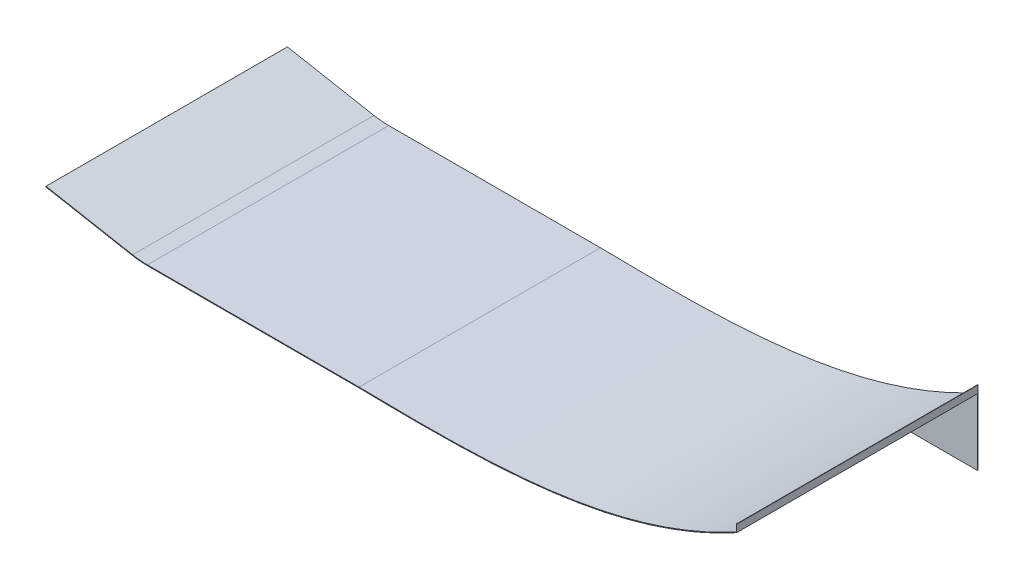
ISO-10303-21;
HEADER;
FILE_DESCRIPTION(('STEP AP214'),'2;1');
FILE_NAME('part.step','',(''),(''),'','','');
FILE_SCHEMA(('AUTOMOTIVE_DESIGN { 1 0 10303 214 1 1 1 1 }'));
ENDSEC;
DATA;
#1=APPLICATION_CONTEXT('core data for automotive mechanical design processes');
#2=APPLICATION_PROTOCOL_DEFINITION('international standard','automotive_design',2000,#1);
#3=PRODUCT_CONTEXT('',#1,'mechanical');
#4=PRODUCT('Part','Part','',(#3));
#5=PRODUCT_RELATED_PRODUCT_CATEGORY('part','',(#4));
#6=PRODUCT_DEFINITION_FORMATION('','',#4);
#7=PRODUCT_DEFINITION_CONTEXT('part definition',#1,'design');
#8=PRODUCT_DEFINITION('design','',#6,#7);
#9=PRODUCT_DEFINITION_SHAPE('','',#8);
#10=(LENGTH_UNIT() NAMED_UNIT(*) SI_UNIT(.MILLI.,.METRE.));
#11=(NAMED_UNIT(*) PLANE_ANGLE_UNIT() SI_UNIT($,.RADIAN.));
#12=(NAMED_UNIT(*) SI_UNIT($,.STERADIAN.) SOLID_ANGLE_UNIT());
#13=UNCERTAINTY_MEASURE_WITH_UNIT(LENGTH_MEASURE(1.E-05),#10,'distance_accuracy_value','');
#14=(GEOMETRIC_REPRESENTATION_CONTEXT(3) GLOBAL_UNCERTAINTY_ASSIGNED_CONTEXT((#13)) GLOBAL_UNIT_ASSIGNED_CONTEXT((#10,
#11,#12)) REPRESENTATION_CONTEXT('',''));
#15=CARTESIAN_POINT('',(0.,0.,0.));
#16=DIRECTION('',(0.,0.,1.));
#17=DIRECTION('',(1.,0.,0.));
#18=AXIS2_PLACEMENT_3D('',#15,#16,#17);
#19=CARTESIAN_POINT('',(-20.0604296246688,1.68392033592968,656.));
#20=DIRECTION('',(-0.182235525492141,-0.983254907563956,0.));
#21=DIRECTION('',(0.983254907563956,-0.182235525492141,0.));
#22=AXIS2_PLACEMENT_3D('',#19,#20,#21);
#23=PLANE('',#22);
#24=DIRECTION('',(0.,0.,-1.));
#25=VECTOR('',#24,1.);
#26=CARTESIAN_POINT('',(-20.0604296246687,1.68392033592971,656.));
#27=LINE('',#26,#25);
#28=CARTESIAN_POINT('',(-20.0604296246687,1.68392033592971,524.8));
#29=VERTEX_POINT('',#28);
#30=CARTESIAN_POINT('',(-20.0604296246687,1.68392033592971,395.6));
#31=VERTEX_POINT('',#30);
#32=EDGE_CURVE('E465',#29,#31,#27,.T.);
#33=ORIENTED_EDGE('',*,*,#32,.F.);
#34=DIRECTION('',(-0.983254907563956,0.182235525492141,0.));
#35=VECTOR('',#34,1.);
#36=CARTESIAN_POINT('',(-20.0604296246688,1.68392033592968,524.8));
#37=LINE('',#36,#35);
#38=CARTESIAN_POINT('',(-255.328384959634,45.2882584807055,524.8));
#39=VERTEX_POINT('',#38);
#40=EDGE_CURVE('E52',#29,#39,#37,.T.);
#41=ORIENTED_EDGE('',*,*,#40,.T.);
#42=DIRECTION('',(0.,0.,-1.));
#43=VECTOR('',#42,1.);
#44=CARTESIAN_POINT('',(-255.328384959634,45.2882584807055,656.));
#45=LINE('',#44,#43);
#46=CARTESIAN_POINT('',(-255.328384959634,45.2882584807055,395.6));
#47=VERTEX_POINT('',#46);
#48=EDGE_CURVE('E485',#39,#47,#45,.T.);
#49=ORIENTED_EDGE('',*,*,#48,.T.);
#50=DIRECTION('',(-0.983254907563956,0.182235525492141,0.));
#51=VECTOR('',#50,1.);
#52=CARTESIAN_POINT('',(-20.0604296246688,1.68392033592968,395.6));
#53=LINE('',#52,#51);
#54=EDGE_CURVE('E276',#31,#47,#53,.T.);
#55=ORIENTED_EDGE('',*,*,#54,.F.);
#56=EDGE_LOOP('',(#33,#41,#49,#55));
#57=FACE_BOUND('',#56,.T.);
#58=ADVANCED_FACE('F37',(#57),#23,.T.);
#59=CARTESIAN_POINT('',(-20.0604296246687,1.68392033592971,393.6));
#60=VERTEX_POINT('',#59);
#61=CARTESIAN_POINT('',(-20.0604296246687,1.68392033592971,264.4));
#62=VERTEX_POINT('',#61);
#63=EDGE_CURVE('E458',#60,#62,#27,.T.);
#64=ORIENTED_EDGE('',*,*,#63,.F.);
#65=DIRECTION('',(-0.983254907563956,0.182235525492141,0.));
#66=VECTOR('',#65,1.);
#67=CARTESIAN_POINT('',(-20.0604296246688,1.68392033592968,393.6));
#68=LINE('',#67,#66);
#69=CARTESIAN_POINT('',(-255.328384959634,45.2882584807055,393.6));
#70=VERTEX_POINT('',#69);
#71=EDGE_CURVE('E60',#60,#70,#68,.T.);
#72=ORIENTED_EDGE('',*,*,#71,.T.);
#73=CARTESIAN_POINT('',(-255.328384959634,45.2882584807055,264.4));
#74=VERTEX_POINT('',#73);
#75=EDGE_CURVE('E484',#70,#74,#45,.T.);
#76=ORIENTED_EDGE('',*,*,#75,.T.);
#77=DIRECTION('',(-0.983254907563956,0.182235525492141,0.));
#78=VECTOR('',#77,1.);
#79=CARTESIAN_POINT('',(-20.0604296246688,1.68392033592968,264.4));
#80=LINE('',#79,#78);
#81=EDGE_CURVE('E295',#62,#74,#80,.T.);
#82=ORIENTED_EDGE('',*,*,#81,.F.);
#83=EDGE_LOOP('',(#64,#72,#76,#82));
#84=FACE_BOUND('',#83,.T.);
#85=ADVANCED_FACE('F417',(#84),#23,.T.);
#86=CARTESIAN_POINT('',(-20.0604296246687,1.68392033592971,262.4));
#87=VERTEX_POINT('',#86);
#88=CARTESIAN_POINT('',(-20.0604296246687,1.68392033592971,133.2));
#89=VERTEX_POINT('',#88);
#90=EDGE_CURVE('E454',#87,#89,#27,.T.);
#91=ORIENTED_EDGE('',*,*,#90,.F.);
#92=DIRECTION('',(-0.983254907563956,0.182235525492141,0.));
#93=VECTOR('',#92,1.);
#94=CARTESIAN_POINT('',(-20.0604296246688,1.68392033592968,262.4));
#95=LINE('',#94,#93);
#96=CARTESIAN_POINT('',(-255.328384959634,45.2882584807055,262.4));
#97=VERTEX_POINT('',#96);
#98=EDGE_CURVE('E292',#87,#97,#95,.T.);
#99=ORIENTED_EDGE('',*,*,#98,.T.);
#100=CARTESIAN_POINT('',(-255.328384959634,45.2882584807055,133.2));
#101=VERTEX_POINT('',#100);
#102=EDGE_CURVE('E467',#97,#101,#45,.T.);
#103=ORIENTED_EDGE('',*,*,#102,.T.);
#104=DIRECTION('',(-0.983254907563956,0.182235525492141,0.));
#105=VECTOR('',#104,1.);
#106=CARTESIAN_POINT('',(-20.0604296246688,1.68392033592968,133.2));
#107=LINE('',#106,#105);
#108=EDGE_CURVE('E314',#89,#101,#107,.T.);
#109=ORIENTED_EDGE('',*,*,#108,.F.);
#110=EDGE_LOOP('',(#91,#99,#103,#109));
#111=FACE_BOUND('',#110,.T.);
#112=ADVANCED_FACE('F424',(#111),#23,.T.);
#113=CARTESIAN_POINT('',(-20.0604296246687,1.68392033592971,131.2));
#114=VERTEX_POINT('',#113);
#115=CARTESIAN_POINT('',(-20.0604296246687,1.68392033592971,2.));
#116=VERTEX_POINT('',#115);
#117=EDGE_CURVE('E451',#114,#116,#27,.T.);
#118=ORIENTED_EDGE('',*,*,#117,.F.);
#119=DIRECTION('',(-0.983254907563956,0.182235525492141,0.));
#120=VECTOR('',#119,1.);
#121=CARTESIAN_POINT('',(-20.0604296246688,1.68392033592968,131.2));
#122=LINE('',#121,#120);
#123=CARTESIAN_POINT('',(-255.328384959634,45.2882584807055,131.2));
#124=VERTEX_POINT('',#123);
#125=EDGE_CURVE('E311',#114,#124,#122,.T.);
#126=ORIENTED_EDGE('',*,*,#125,.T.);
#127=CARTESIAN_POINT('',(-255.328384959634,45.2882584807055,2.));
#128=VERTEX_POINT('',#127);
#129=EDGE_CURVE('E464',#124,#128,#45,.T.);
#130=ORIENTED_EDGE('',*,*,#129,.T.);
#131=DIRECTION('',(-0.983254907563956,0.182235525492141,0.));
#132=VECTOR('',#131,1.);
#133=CARTESIAN_POINT('',(-255.328384959634,45.2882584807055,2.));
#134=LINE('',#133,#132);
#135=EDGE_CURVE('E321',#116,#128,#134,.T.);
#136=ORIENTED_EDGE('',*,*,#135,.F.);
#137=EDGE_LOOP('',(#118,#126,#130,#136));
#138=FACE_BOUND('',#137,.T.);
#139=ADVANCED_FACE('F432',(#138),#23,.T.);
#140=CARTESIAN_POINT('',(20.2151601669387,0.,656.));
#141=DIRECTION('',(0.,1.,0.));
#142=DIRECTION('',(0.,0.,1.));
#143=AXIS2_PLACEMENT_3D('',#140,#141,#142);
#144=PLANE('',#143);
#145=DIRECTION('',(1.,0.,0.));
#146=VECTOR('',#145,1.);
#147=CARTESIAN_POINT('',(20.2151601669387,0.,0.));
#148=LINE('',#147,#146);
#149=CARTESIAN_POINT('',(20.2151601669387,0.,0.));
#150=VERTEX_POINT('',#149);
#151=CARTESIAN_POINT('',(595.62,0.,0.));
#152=VERTEX_POINT('',#151);
#153=EDGE_CURVE('E341',#150,#152,#148,.T.);
#154=ORIENTED_EDGE('',*,*,#153,.F.);
#155=DIRECTION('',(0.,0.,-1.));
#156=VECTOR('',#155,1.);
#157=CARTESIAN_POINT('',(20.2151601669387,0.,656.));
#158=LINE('',#157,#156);
#159=CARTESIAN_POINT('',(20.2151601669387,0.,656.));
#160=VERTEX_POINT('',#159);
#161=EDGE_CURVE('E491',#160,#150,#158,.T.);
#162=ORIENTED_EDGE('',*,*,#161,.F.);
#163=DIRECTION('',(1.,0.,0.));
#164=VECTOR('',#163,1.);
#165=CARTESIAN_POINT('',(20.2151601669387,0.,656.));
#166=LINE('',#165,#164);
#167=CARTESIAN_POINT('',(595.62,0.,656.));
#168=VERTEX_POINT('',#167);
#169=EDGE_CURVE('E346',#160,#168,#166,.T.);
#170=ORIENTED_EDGE('',*,*,#169,.T.);
#171=DIRECTION('',(0.,0.,-1.));
#172=VECTOR('',#171,1.);
#173=CARTESIAN_POINT('',(595.62,0.,656.));
#174=LINE('',#173,#172);
#175=EDGE_CURVE('E523',#168,#152,#174,.T.);
#176=ORIENTED_EDGE('',*,*,#175,.T.);
#177=EDGE_LOOP('',(#154,#162,#170,#176));
#178=FACE_BOUND('',#177,.T.);
#179=ADVANCED_FACE('F39',(#178),#144,.T.);
#180=CARTESIAN_POINT('',(20.2151601669379,220.,656.));
#181=DIRECTION('',(0.,0.,-1.));
#182=DIRECTION('',(-1.,0.,0.));
#183=AXIS2_PLACEMENT_3D('',#180,#181,#182);
#184=CYLINDRICAL_SURFACE('',#183,220.);
#185=ORIENTED_EDGE('',*,*,#161,.T.);
#186=CARTESIAN_POINT('',(20.2151601669379,220.,0.));
#187=DIRECTION('',(0.,0.,-1.));
#188=DIRECTION('',(-1.,0.,0.));
#189=AXIS2_PLACEMENT_3D('',#186,#187,#188);
#190=CIRCLE('',#189,220.);
#191=CARTESIAN_POINT('',(-19.8766554413338,3.68392033592986,0.));
#192=VERTEX_POINT('',#191);
#193=EDGE_CURVE('E494',#150,#192,#190,.T.);
#194=ORIENTED_EDGE('',*,*,#193,.T.);
#195=DIRECTION('',(0.,0.,-1.));
#196=VECTOR('',#195,1.);
#197=CARTESIAN_POINT('',(-19.8766554413338,3.68392033592986,656.));
#198=LINE('',#197,#196);
#199=CARTESIAN_POINT('',(-19.8766554413338,3.68392033592986,656.));
#200=VERTEX_POINT('',#199);
#201=EDGE_CURVE('E489',#200,#192,#198,.T.);
#202=ORIENTED_EDGE('',*,*,#201,.F.);
#203=CARTESIAN_POINT('',(20.2151601669379,220.,656.));
#204=DIRECTION('',(0.,0.,-1.));
#205=DIRECTION('',(-1.,0.,0.));
#206=AXIS2_PLACEMENT_3D('',#203,#204,#205);
#207=CIRCLE('',#206,220.);
#208=EDGE_CURVE('E521',#160,#200,#207,.T.);
#209=ORIENTED_EDGE('',*,*,#208,.F.);
#210=EDGE_LOOP('',(#185,#194,#202,#209));
#211=FACE_BOUND('',#210,.T.);
#212=ADVANCED_FACE('F446',(#211),#184,.F.);
#213=CARTESIAN_POINT('',(-19.8766554413338,3.68392033592986,656.));
#214=DIRECTION('',(-0.182235525492141,-0.983254907563956,0.));
#215=DIRECTION('',(0.983254907563956,-0.182235525492141,0.));
#216=AXIS2_PLACEMENT_3D('',#213,#214,#215);
#217=PLANE('',#216);
#218=ORIENTED_EDGE('',*,*,#201,.T.);
#219=DIRECTION('',(-0.983254907563956,0.182235525492141,0.));
#220=VECTOR('',#219,1.);
#221=CARTESIAN_POINT('',(-19.8766554413338,3.68392033592986,0.));
#222=LINE('',#221,#220);
#223=CARTESIAN_POINT('',(-255.328384959634,47.322319012328,0.));
#224=VERTEX_POINT('',#223);
#225=EDGE_CURVE('E497',#192,#224,#222,.T.);
#226=ORIENTED_EDGE('',*,*,#225,.T.);
#227=DIRECTION('',(0.,0.,-1.));
#228=VECTOR('',#227,1.);
#229=CARTESIAN_POINT('',(-255.328384959634,47.322319012328,656.));
#230=LINE('',#229,#228);
#231=CARTESIAN_POINT('',(-255.328384959634,47.322319012328,656.));
#232=VERTEX_POINT('',#231);
#233=EDGE_CURVE('E487',#232,#224,#230,.T.);
#234=ORIENTED_EDGE('',*,*,#233,.F.);
#235=DIRECTION('',(-0.983254907563956,0.182235525492141,0.));
#236=VECTOR('',#235,1.);
#237=CARTESIAN_POINT('',(-19.8766554413338,3.68392033592986,656.));
#238=LINE('',#237,#236);
#239=EDGE_CURVE('E524',#200,#232,#238,.T.);
#240=ORIENTED_EDGE('',*,*,#239,.F.);
#241=EDGE_LOOP('',(#218,#226,#234,#240));
#242=FACE_BOUND('',#241,.T.);
#243=ADVANCED_FACE('F439',(#242),#217,.F.);
#244=CARTESIAN_POINT('',(-255.328384959634,45.2882584807055,656.));
#245=DIRECTION('',(-1.,0.,0.));
#246=DIRECTION('',(0.,0.,1.));
#247=AXIS2_PLACEMENT_3D('',#244,#245,#246);
#248=PLANE('',#247);
#249=ORIENTED_EDGE('',*,*,#233,.T.);
#250=DIRECTION('',(0.,1.,0.));
#251=VECTOR('',#250,1.);
#252=CARTESIAN_POINT('',(-255.328384959634,45.2882584807055,0.));
#253=LINE('',#252,#251);
#254=CARTESIAN_POINT('',(-255.328384959634,-10.,0.));
#255=VERTEX_POINT('',#254);
#256=EDGE_CURVE('E500',#255,#224,#253,.T.);
#257=ORIENTED_EDGE('',*,*,#256,.F.);
#258=DIRECTION('',(0.,0.,-1.));
#259=VECTOR('',#258,1.);
#260=CARTESIAN_POINT('',(-255.328384959634,-10.,2.));
#261=LINE('',#260,#259);
#262=CARTESIAN_POINT('',(-255.328384959634,-10.,2.));
#263=VERTEX_POINT('',#262);
#264=EDGE_CURVE('E338',#263,#255,#261,.T.);
#265=ORIENTED_EDGE('',*,*,#264,.F.);
#266=DIRECTION('',(0.,-1.,0.));
#267=VECTOR('',#266,1.);
#268=CARTESIAN_POINT('',(-255.328384959634,-10.,2.));
#269=LINE('',#268,#267);
#270=EDGE_CURVE('E324',#128,#263,#269,.T.);
#271=ORIENTED_EDGE('',*,*,#270,.F.);
#272=ORIENTED_EDGE('',*,*,#129,.F.);
#273=DIRECTION('',(0.,-1.,0.));
#274=VECTOR('',#273,1.);
#275=CARTESIAN_POINT('',(-255.328384959634,47.322319012328,131.2));
#276=LINE('',#275,#274);
#277=CARTESIAN_POINT('',(-255.328384959634,0.,131.2));
#278=VERTEX_POINT('',#277);
#279=EDGE_CURVE('E298',#124,#278,#276,.T.);
#280=ORIENTED_EDGE('',*,*,#279,.T.);
#281=DIRECTION('',(0.,0.,-1.));
#282=VECTOR('',#281,1.);
#283=CARTESIAN_POINT('',(-255.328384959634,0.,133.2));
#284=LINE('',#283,#282);
#285=CARTESIAN_POINT('',(-255.328384959634,0.,133.2));
#286=VERTEX_POINT('',#285);
#287=EDGE_CURVE('E305',#286,#278,#284,.T.);
#288=ORIENTED_EDGE('',*,*,#287,.F.);
#289=DIRECTION('',(0.,-1.,0.));
#290=VECTOR('',#289,1.);
#291=CARTESIAN_POINT('',(-255.328384959634,47.322319012328,133.2));
#292=LINE('',#291,#290);
#293=EDGE_CURVE('E299',#101,#286,#292,.T.);
#294=ORIENTED_EDGE('',*,*,#293,.F.);
#295=ORIENTED_EDGE('',*,*,#102,.F.);
#296=DIRECTION('',(0.,-1.,0.));
#297=VECTOR('',#296,1.);
#298=CARTESIAN_POINT('',(-255.328384959634,47.322319012328,262.4));
#299=LINE('',#298,#297);
#300=CARTESIAN_POINT('',(-255.328384959634,0.,262.4));
#301=VERTEX_POINT('',#300);
#302=EDGE_CURVE('E279',#97,#301,#299,.T.);
#303=ORIENTED_EDGE('',*,*,#302,.T.);
#304=DIRECTION('',(0.,0.,-1.));
#305=VECTOR('',#304,1.);
#306=CARTESIAN_POINT('',(-255.328384959634,0.,264.4));
#307=LINE('',#306,#305);
#308=CARTESIAN_POINT('',(-255.328384959634,0.,264.4));
#309=VERTEX_POINT('',#308);
#310=EDGE_CURVE('E286',#309,#301,#307,.T.);
#311=ORIENTED_EDGE('',*,*,#310,.F.);
#312=DIRECTION('',(0.,-1.,0.));
#313=VECTOR('',#312,1.);
#314=CARTESIAN_POINT('',(-255.328384959634,47.322319012328,264.4));
#315=LINE('',#314,#313);
#316=EDGE_CURVE('E280',#74,#309,#315,.T.);
#317=ORIENTED_EDGE('',*,*,#316,.F.);
#318=ORIENTED_EDGE('',*,*,#75,.F.);
#319=DIRECTION('',(0.,-1.,0.));
#320=VECTOR('',#319,1.);
#321=CARTESIAN_POINT('',(-255.328384959634,47.322319012328,393.6));
#322=LINE('',#321,#320);
#323=CARTESIAN_POINT('',(-255.328384959634,0.,393.6));
#324=VERTEX_POINT('',#323);
#325=EDGE_CURVE('E262',#70,#324,#322,.T.);
#326=ORIENTED_EDGE('',*,*,#325,.T.);
#327=DIRECTION('',(0.,0.,-1.));
#328=VECTOR('',#327,1.);
#329=CARTESIAN_POINT('',(-255.328384959634,0.,395.6));
#330=LINE('',#329,#328);
#331=CARTESIAN_POINT('',(-255.328384959634,0.,395.6));
#332=VERTEX_POINT('',#331);
#333=EDGE_CURVE('E269',#332,#324,#330,.T.);
#334=ORIENTED_EDGE('',*,*,#333,.F.);
#335=DIRECTION('',(0.,-1.,0.));
#336=VECTOR('',#335,1.);
#337=CARTESIAN_POINT('',(-255.328384959634,47.322319012328,395.6));
#338=LINE('',#337,#336);
#339=EDGE_CURVE('E263',#47,#332,#338,.T.);
#340=ORIENTED_EDGE('',*,*,#339,.F.);
#341=ORIENTED_EDGE('',*,*,#48,.F.);
#342=DIRECTION('',(0.,-1.,0.));
#343=VECTOR('',#342,1.);
#344=CARTESIAN_POINT('',(-255.328384959634,47.322319012328,524.8));
#345=LINE('',#344,#343);
#346=CARTESIAN_POINT('',(-255.328384959634,0.,524.8));
#347=VERTEX_POINT('',#346);
#348=EDGE_CURVE('E249',#39,#347,#345,.T.);
#349=ORIENTED_EDGE('',*,*,#348,.T.);
#350=DIRECTION('',(0.,0.,-1.));
#351=VECTOR('',#350,1.);
#352=CARTESIAN_POINT('',(-255.328384959634,0.,526.8));
#353=LINE('',#352,#351);
#354=CARTESIAN_POINT('',(-255.328384959634,0.,526.8));
#355=VERTEX_POINT('',#354);
#356=EDGE_CURVE('E246',#355,#347,#353,.T.);
#357=ORIENTED_EDGE('',*,*,#356,.F.);
#358=DIRECTION('',(0.,-1.,0.));
#359=VECTOR('',#358,1.);
#360=CARTESIAN_POINT('',(-255.328384959634,47.322319012328,526.8));
#361=LINE('',#360,#359);
#362=CARTESIAN_POINT('',(-255.328384959634,45.2882584807055,526.8));
#363=VERTEX_POINT('',#362);
#364=EDGE_CURVE('E233',#363,#355,#361,.T.);
#365=ORIENTED_EDGE('',*,*,#364,.F.);
#366=CARTESIAN_POINT('',(-255.328384959634,45.2882584807055,656.));
#367=VERTEX_POINT('',#366);
#368=EDGE_CURVE('E468',#367,#363,#45,.T.);
#369=ORIENTED_EDGE('',*,*,#368,.F.);
#370=DIRECTION('',(0.,1.,0.));
#371=VECTOR('',#370,1.);
#372=CARTESIAN_POINT('',(-255.328384959634,45.2882584807055,656.));
#373=LINE('',#372,#371);
#374=EDGE_CURVE('E526',#367,#232,#373,.T.);
#375=ORIENTED_EDGE('',*,*,#374,.T.);
#376=EDGE_LOOP('',(#249,#257,#265,#271,#272,#280,#288,#294,#295,#303,#311,#317,#318,#326,#334,
#340,#341,#349,#357,#365,#369,#375));
#377=FACE_BOUND('',#376,.T.);
#378=ADVANCED_FACE('F247',(#377),#248,.T.);
#379=DIRECTION('',(-0.983254907563956,0.182235525492141,0.));
#380=VECTOR('',#379,1.);
#381=CARTESIAN_POINT('',(-20.0604296246688,1.68392033592968,526.8));
#382=LINE('',#381,#380);
#383=CARTESIAN_POINT('',(-20.0604296246687,1.68392033592971,526.8));
#384=VERTEX_POINT('',#383);
#385=EDGE_CURVE('E240',#384,#363,#382,.T.);
#386=ORIENTED_EDGE('',*,*,#385,.F.);
#387=CARTESIAN_POINT('',(-20.0604296246687,1.68392033592971,656.));
#388=VERTEX_POINT('',#387);
#389=EDGE_CURVE('E457',#388,#384,#27,.T.);
#390=ORIENTED_EDGE('',*,*,#389,.F.);
#391=DIRECTION('',(-0.983254907563956,0.182235525492141,0.));
#392=VECTOR('',#391,1.);
#393=CARTESIAN_POINT('',(-20.0604296246688,1.68392033592968,656.));
#394=LINE('',#393,#392);
#395=EDGE_CURVE('E529',#388,#367,#394,.T.);
#396=ORIENTED_EDGE('',*,*,#395,.T.);
#397=ORIENTED_EDGE('',*,*,#368,.T.);
#398=EDGE_LOOP('',(#386,#390,#396,#397));
#399=FACE_BOUND('',#398,.T.);
#400=ADVANCED_FACE('F420',(#399),#23,.T.);
#401=CARTESIAN_POINT('',(20.0313859836022,218.,656.));
#402=DIRECTION('',(0.,0.,-1.));
#403=DIRECTION('',(-1.,0.,0.));
#404=AXIS2_PLACEMENT_3D('',#401,#402,#403);
#405=CYLINDRICAL_SURFACE('',#404,220.);
#406=CARTESIAN_POINT('',(20.0313859836022,218.,526.8));
#407=DIRECTION('',(0.,0.,1.));
#408=DIRECTION('',(1.,0.,0.));
#409=AXIS2_PLACEMENT_3D('',#406,#407,#408);
#410=CIRCLE('',#409,220.);
#411=CARTESIAN_POINT('',(-9.56591119029526,0.,526.8));
#412=VERTEX_POINT('',#411);
#413=EDGE_CURVE('E11',#412,#384,#410,.F.);
#414=ORIENTED_EDGE('',*,*,#413,.F.);
#415=DIRECTION('',(0.,0.,-1.));
#416=VECTOR('',#415,1.);
#417=CARTESIAN_POINT('',(-9.56591119029526,0.,656.));
#418=LINE('',#417,#416);
#419=CARTESIAN_POINT('',(-9.56591119029526,0.,524.8));
#420=VERTEX_POINT('',#419);
#421=EDGE_CURVE('E45',#412,#420,#418,.T.);
#422=ORIENTED_EDGE('',*,*,#421,.T.);
#423=CARTESIAN_POINT('',(20.0313859836022,218.,524.8));
#424=DIRECTION('',(0.,0.,1.));
#425=DIRECTION('',(1.,0.,0.));
#426=AXIS2_PLACEMENT_3D('',#423,#424,#425);
#427=CIRCLE('',#426,220.);
#428=EDGE_CURVE('E861',#420,#29,#427,.F.);
#429=ORIENTED_EDGE('',*,*,#428,.T.);
#430=ORIENTED_EDGE('',*,*,#32,.T.);
#431=CARTESIAN_POINT('',(20.0313859836022,218.,395.6));
#432=DIRECTION('',(0.,0.,1.));
#433=DIRECTION('',(1.,0.,0.));
#434=AXIS2_PLACEMENT_3D('',#431,#432,#433);
#435=CIRCLE('',#434,220.);
#436=CARTESIAN_POINT('',(-9.56591119029526,0.,395.6));
#437=VERTEX_POINT('',#436);
#438=EDGE_CURVE('E859',#437,#31,#435,.F.);
#439=ORIENTED_EDGE('',*,*,#438,.F.);
#440=DIRECTION('',(0.,0.,-1.));
#441=VECTOR('',#440,1.);
#442=CARTESIAN_POINT('',(-9.56591119029526,0.,656.));
#443=LINE('',#442,#441);
#444=CARTESIAN_POINT('',(-9.56591119029526,0.,393.6));
#445=VERTEX_POINT('',#444);
#446=EDGE_CURVE('E857',#437,#445,#443,.T.);
#447=ORIENTED_EDGE('',*,*,#446,.T.);
#448=CARTESIAN_POINT('',(20.0313859836022,218.,393.6));
#449=DIRECTION('',(0.,0.,1.));
#450=DIRECTION('',(1.,0.,0.));
#451=AXIS2_PLACEMENT_3D('',#448,#449,#450);
#452=CIRCLE('',#451,220.);
#453=EDGE_CURVE('E477',#445,#60,#452,.F.);
#454=ORIENTED_EDGE('',*,*,#453,.T.);
#455=ORIENTED_EDGE('',*,*,#63,.T.);
#456=CARTESIAN_POINT('',(20.0313859836022,218.,264.4));
#457=DIRECTION('',(0.,0.,1.));
#458=DIRECTION('',(1.,0.,0.));
#459=AXIS2_PLACEMENT_3D('',#456,#457,#458);
#460=CIRCLE('',#459,220.);
#461=CARTESIAN_POINT('',(-9.56591119029526,0.,264.4));
#462=VERTEX_POINT('',#461);
#463=EDGE_CURVE('E475',#462,#62,#460,.F.);
#464=ORIENTED_EDGE('',*,*,#463,.F.);
#465=DIRECTION('',(0.,0.,-1.));
#466=VECTOR('',#465,1.);
#467=CARTESIAN_POINT('',(-9.56591119029526,0.,656.));
#468=LINE('',#467,#466);
#469=CARTESIAN_POINT('',(-9.56591119029526,0.,262.4));
#470=VERTEX_POINT('',#469);
#471=EDGE_CURVE('E481',#462,#470,#468,.T.);
#472=ORIENTED_EDGE('',*,*,#471,.T.);
#473=CARTESIAN_POINT('',(20.0313859836022,218.,262.4));
#474=DIRECTION('',(0.,0.,1.));
#475=DIRECTION('',(1.,0.,0.));
#476=AXIS2_PLACEMENT_3D('',#473,#474,#475);
#477=CIRCLE('',#476,220.);
#478=EDGE_CURVE('E852',#470,#87,#477,.F.);
#479=ORIENTED_EDGE('',*,*,#478,.T.);
#480=ORIENTED_EDGE('',*,*,#90,.T.);
#481=CARTESIAN_POINT('',(20.0313859836022,218.,133.2));
#482=DIRECTION('',(0.,0.,1.));
#483=DIRECTION('',(1.,0.,0.));
#484=AXIS2_PLACEMENT_3D('',#481,#482,#483);
#485=CIRCLE('',#484,220.);
#486=CARTESIAN_POINT('',(-9.56591119029526,0.,133.2));
#487=VERTEX_POINT('',#486);
#488=EDGE_CURVE('E846',#487,#89,#485,.F.);
#489=ORIENTED_EDGE('',*,*,#488,.F.);
#490=DIRECTION('',(0.,0.,-1.));
#491=VECTOR('',#490,1.);
#492=CARTESIAN_POINT('',(-9.56591119029526,0.,656.));
#493=LINE('',#492,#491);
#494=CARTESIAN_POINT('',(-9.56591119029526,0.,131.2));
#495=VERTEX_POINT('',#494);
#496=EDGE_CURVE('E844',#487,#495,#493,.T.);
#497=ORIENTED_EDGE('',*,*,#496,.T.);
#498=CARTESIAN_POINT('',(20.0313859836022,218.,131.2));
#499=DIRECTION('',(0.,0.,1.));
#500=DIRECTION('',(1.,0.,0.));
#501=AXIS2_PLACEMENT_3D('',#498,#499,#500);
#502=CIRCLE('',#501,220.);
#503=EDGE_CURVE('E493',#495,#114,#502,.F.);
#504=ORIENTED_EDGE('',*,*,#503,.T.);
#505=ORIENTED_EDGE('',*,*,#117,.T.);
#506=CARTESIAN_POINT('',(20.0313859836022,218.,2.));
#507=DIRECTION('',(0.,0.,-1.));
#508=DIRECTION('',(1.,0.,0.));
#509=AXIS2_PLACEMENT_3D('',#506,#507,#508);
#510=CIRCLE('',#509,220.);
#511=CARTESIAN_POINT('',(20.0313859836022,-2.,2.));
#512=VERTEX_POINT('',#511);
#513=EDGE_CURVE('E318',#512,#116,#510,.T.);
#514=ORIENTED_EDGE('',*,*,#513,.F.);
#515=DIRECTION('',(0.,0.,-1.));
#516=VECTOR('',#515,1.);
#517=CARTESIAN_POINT('',(20.0313859836022,-2.,656.));
#518=LINE('',#517,#516);
#519=CARTESIAN_POINT('',(20.0313859836022,-2.,656.));
#520=VERTEX_POINT('',#519);
#521=EDGE_CURVE('E455',#520,#512,#518,.T.);
#522=ORIENTED_EDGE('',*,*,#521,.F.);
#523=CARTESIAN_POINT('',(20.0313859836022,218.,656.));
#524=DIRECTION('',(0.,0.,-1.));
#525=DIRECTION('',(-1.,0.,0.));
#526=AXIS2_PLACEMENT_3D('',#523,#524,#525);
#527=CIRCLE('',#526,220.);
#528=EDGE_CURVE('E532',#520,#388,#527,.T.);
#529=ORIENTED_EDGE('',*,*,#528,.T.);
#530=ORIENTED_EDGE('',*,*,#389,.T.);
#531=EDGE_LOOP('',(#414,#422,#429,#430,#439,#447,#454,#455,#464,#472,#479,#480,#489,#497,#504,
#505,#514,#522,#529,#530));
#532=FACE_BOUND('',#531,.T.);
#533=ADVANCED_FACE('F430',(#532),#405,.T.);
#534=CARTESIAN_POINT('',(20.0313859836022,-2.,656.));
#535=DIRECTION('',(0.,1.,0.));
#536=DIRECTION('',(-1.,0.,0.));
#537=AXIS2_PLACEMENT_3D('',#534,#535,#536);
#538=PLANE('',#537);
#539=ORIENTED_EDGE('',*,*,#521,.T.);
#540=DIRECTION('',(-1.,0.,0.));
#541=VECTOR('',#540,1.);
#542=CARTESIAN_POINT('',(20.0313859836022,-2.,2.));
#543=LINE('',#542,#541);
#544=CARTESIAN_POINT('',(595.602829306607,-2.,1.99999999999989));
#545=VERTEX_POINT('',#544);
#546=EDGE_CURVE('E329',#545,#512,#543,.T.);
#547=ORIENTED_EDGE('',*,*,#546,.F.);
#548=DIRECTION('',(0.,0.,-1.));
#549=VECTOR('',#548,1.);
#550=CARTESIAN_POINT('',(595.602829306607,-2.,656.));
#551=LINE('',#550,#549);
#552=CARTESIAN_POINT('',(595.602829306607,-2.,656.));
#553=VERTEX_POINT('',#552);
#554=EDGE_CURVE('E460',#553,#545,#551,.T.);
#555=ORIENTED_EDGE('',*,*,#554,.F.);
#556=DIRECTION('',(1.,0.,0.));
#557=VECTOR('',#556,1.);
#558=CARTESIAN_POINT('',(20.0313859836022,-2.,656.));
#559=LINE('',#558,#557);
#560=EDGE_CURVE('E534',#520,#553,#559,.T.);
#561=ORIENTED_EDGE('',*,*,#560,.F.);
#562=EDGE_LOOP('',(#539,#547,#555,#561));
#563=FACE_BOUND('',#562,.T.);
#564=ADVANCED_FACE('F437',(#563),#538,.F.);
#565=CARTESIAN_POINT('',(1621.83533122092,170.367951158095,656.));
#566=CARTESIAN_POINT('',(1616.7747930485,167.588194306789,656.));
#567=CARTESIAN_POINT('',(1606.5948821147,162.089975973147,656.));
#568=CARTESIAN_POINT('',(1586.23710328257,151.463515800709,656.));
#569=CARTESIAN_POINT('',(1560.68594999935,138.804453476005,656.));
#570=CARTESIAN_POINT('',(1529.896447866,124.599348202011,656.));
#571=CARTESIAN_POINT('',(1488.66610915932,106.924955828573,656.));
#572=CARTESIAN_POINT('',(1436.8105781562,87.1296387638426,656.));
#573=CARTESIAN_POINT('',(1374.10567941651,66.7985678986576,656.));
#574=CARTESIAN_POINT('',(1310.95447142663,49.6388059956324,656.));
#575=CARTESIAN_POINT('',(1226.19922470357,30.650867762238,656.));
#576=CARTESIAN_POINT('',(1119.29493968227,13.5816619273028,656.));
#577=CARTESIAN_POINT('',(989.717791404692,1.74315822680182,656.));
#578=CARTESIAN_POINT('',(859.093886549318,-3.47065993499815,656.));
#579=CARTESIAN_POINT('',(749.560168834067,-3.97672253394286,656.));
#580=CARTESIAN_POINT('',(661.665201282511,-3.08699523901113,656.));
#581=CARTESIAN_POINT('',(617.614395376695,-2.37797555920262,656.));
#582=CARTESIAN_POINT('',(595.602829306607,-2.,656.));
#583=B_SPLINE_CURVE_WITH_KNOTS('',3,(#565,#566,#567,#568,#569,#570,#571,#572,#573,#574,#575,
#576,#577,#578,#579,#580,#581,#582),.UNSPECIFIED.,.F.,.F.,(4,1,1,1,1,1,1,1,1,1,1,1,1,1,1,4),
(1.62377143606562E-05,0.0156409840000737,0.0312657302857868,0.0625152228572131,
0.0937647154286394,0.125014208000066,0.187513193142918,0.25001217828577,0.312511163428623,
0.375010148571475,0.50000811885718,0.625006089142885,0.75000405942859,0.875002029714295,
0.937501014857148,1.),.UNSPECIFIED.);
#584=DIRECTION('',(0.,0.,-1.));
#585=VECTOR('',#584,1.);
#586=SURFACE_OF_LINEAR_EXTRUSION('',#583,#585);
#587=CARTESIAN_POINT('',(1621.83533122092,170.367951158095,2.));
#588=CARTESIAN_POINT('',(1620.12406717171,169.427964923612,2.));
#589=CARTESIAN_POINT('',(1618.41055694044,168.492074258924,2.));
#590=CARTESIAN_POINT('',(1614.97908515335,166.628489556225,2.));
#591=CARTESIAN_POINT('',(1613.26112359784,165.700795517612,2.));
#592=CARTESIAN_POINT('',(1608.10063354837,162.930021960882,2.));
#593=CARTESIAN_POINT('',(1604.65148930365,161.09924530713,2.));
#594=CARTESIAN_POINT('',(1597.73650262686,157.471239192516,2.));
#595=CARTESIAN_POINT('',(1594.27066374525,155.67400296332,2.));
#596=CARTESIAN_POINT('',(1587.32197303505,152.112752971223,2.));
#597=CARTESIAN_POINT('',(1583.83912120555,150.348739210088,2.));
#598=CARTESIAN_POINT('',(1573.36658735793,145.107243213579,2.));
#599=CARTESIAN_POINT('',(1566.35181419511,141.6797224803,2.));
#600=CARTESIAN_POINT('',(1552.25892490443,134.959407188301,2.));
#601=CARTESIAN_POINT('',(1545.18081498217,131.666599603082,2.));
#602=CARTESIAN_POINT('',(1530.96374140095,125.216000356792,2.));
#603=CARTESIAN_POINT('',(1523.82478070748,122.058202160815,2.));
#604=CARTESIAN_POINT('',(1509.48869941116,115.877677523841,2.));
#605=CARTESIAN_POINT('',(1502.2915792242,112.854950117985,2.));
#606=CARTESIAN_POINT('',(1487.89452813476,106.9659044846,2.));
#607=CARTESIAN_POINT('',(1480.69499607818,104.098610994521,2.));
#608=CARTESIAN_POINT('',(1466.24435270963,98.4965547433775,2.));
#609=CARTESIAN_POINT('',(1458.99324008948,95.7617953574537,2.));
#610=CARTESIAN_POINT('',(1444.44244117212,90.4240678757353,2.));
#611=CARTESIAN_POINT('',(1437.14275346584,87.8211036221089,2.));
#612=CARTESIAN_POINT('',(1422.49790620269,82.7459458128878,2.));
#613=CARTESIAN_POINT('',(1415.15274572515,80.2737549147798,2.));
#614=CARTESIAN_POINT('',(1400.42014943076,75.4588536638131,2.));
#615=CARTESIAN_POINT('',(1393.03271374944,73.1161428961063,2.));
#616=CARTESIAN_POINT('',(1378.21885140421,68.5586452393599,2.));
#617=CARTESIAN_POINT('',(1370.79242644761,66.3438527990293,2.));
#618=CARTESIAN_POINT('',(1356.14546036395,62.1101794148574,2.));
#619=CARTESIAN_POINT('',(1348.92608319207,60.087268659936,2.));
#620=CARTESIAN_POINT('',(1334.45613191208,56.1573633843974,2.));
#621=CARTESIAN_POINT('',(1327.20555890836,54.2503647958858,2.));
#622=CARTESIAN_POINT('',(1312.67550918079,50.5500192556991,2.));
#623=CARTESIAN_POINT('',(1305.39603254576,48.7566719550811,2.));
#624=CARTESIAN_POINT('',(1290.81050131312,45.2812078608634,2.));
#625=CARTESIAN_POINT('',(1283.5044464091,43.5990923539895,2.));
#626=CARTESIAN_POINT('',(1268.86812032562,40.3435237288006,2.));
#627=CARTESIAN_POINT('',(1261.53784895079,38.7700714894385,2.));
#628=CARTESIAN_POINT('',(1246.8554848284,35.7291215836973,2.));
#629=CARTESIAN_POINT('',(1239.5033923888,34.261622429266,2.));
#630=CARTESIAN_POINT('',(1224.75066112876,31.4241330794609,2.));
#631=CARTESIAN_POINT('',(1217.34994484066,30.054545957508,2.));
#632=CARTESIAN_POINT('',(1202.53075114288,27.4161837030053,2.));
#633=CARTESIAN_POINT('',(1195.11227413419,26.1474063161674,2.));
#634=CARTESIAN_POINT('',(1180.25937883555,23.7074624080486,2.));
#635=CARTESIAN_POINT('',(1172.82496071093,22.5362948794497,2.));
#636=CARTESIAN_POINT('',(1157.94201784762,20.2882929181709,2.));
#637=CARTESIAN_POINT('',(1150.49349334247,19.2114569375741,2.));
#638=CARTESIAN_POINT('',(1135.58417167432,17.1487690786329,2.));
#639=CARTESIAN_POINT('',(1128.12337501965,16.1629135237472,2.));
#640=CARTESIAN_POINT('',(1113.19139440723,14.2787760775153,2.));
#641=CARTESIAN_POINT('',(1105.72021135203,13.3804870069325,2.));
#642=CARTESIAN_POINT('',(1084.28933929531,10.9258065328804,2.));
#643=CARTESIAN_POINT('',(1070.31759884052,9.4737234461672,2.));
#644=CARTESIAN_POINT('',(1042.34888145763,6.83905128890666,2.));
#645=CARTESIAN_POINT('',(1028.35190430307,5.65646464896454,2.));
#646=CARTESIAN_POINT('',(1000.33681657803,3.53708339758782,2.));
#647=CARTESIAN_POINT('',(986.318702530798,2.60033501185582,2.));
#648=CARTESIAN_POINT('',(958.265628196714,0.94907589843014,2.));
#649=CARTESIAN_POINT('',(944.230664317945,0.234626829624468,2.));
#650=CARTESIAN_POINT('',(916.148117002588,-0.995464588052509,2.));
#651=CARTESIAN_POINT('',(902.100531105415,-1.5110500459473,2.));
#652=CARTESIAN_POINT('',(873.99697286605,-2.36672258931074,2.));
#653=CARTESIAN_POINT('',(859.940999351501,-2.70677045063787,2.));
#654=CARTESIAN_POINT('',(831.966730648101,-3.23187268959701,2.));
#655=CARTESIAN_POINT('',(818.048463042364,-3.41844172442878,2.));
#656=CARTESIAN_POINT('',(790.211923093697,-3.66461204086833,2.));
#657=CARTESIAN_POINT('',(776.293650830508,-3.72422291021594,2.));
#658=CARTESIAN_POINT('',(748.461212493504,-3.73860108729294,2.));
#659=CARTESIAN_POINT('',(734.547046419361,-3.6933993125722,2.));
#660=CARTESIAN_POINT('',(706.726932299365,-3.5200676363061,2.));
#661=CARTESIAN_POINT('',(692.820983945229,-3.39198338929514,2.));
#662=CARTESIAN_POINT('',(665.021417377585,-3.07459656593587,2.));
#663=CARTESIAN_POINT('',(651.127798554694,-2.88534514374275,2.));
#664=CARTESIAN_POINT('',(630.295745409225,-2.57165335104573,2.));
#665=CARTESIAN_POINT('',(623.357076313746,-2.46219118354122,2.));
#666=CARTESIAN_POINT('',(609.479867571732,-2.23593685528226,2.));
#667=CARTESIAN_POINT('',(602.541327925019,-2.11914470551478,2.));
#668=CARTESIAN_POINT('',(595.602829306607,-2.,2.));
#669=B_SPLINE_CURVE_WITH_KNOTS('',3,(#587,#588,#589,#590,#591,#592,#593,#594,#595,#596,#597,
#598,#599,#600,#601,#602,#603,#604,#605,#606,#607,#608,#609,#610,#611,#612,#613,#614,#615,#616,
#617,#618,#619,#620,#621,#622,#623,#624,#625,#626,#627,#628,#629,#630,#631,#632,#633,#634,#635,
#636,#637,#638,#639,#640,#641,#642,#643,#644,#645,#646,#647,#648,#649,#650,#651,#652,#653,#654,
#655,#656,#657,#658,#659,#660,#661,#662,#663,#664,#665,#666,#667,#668),.UNSPECIFIED.,.F.,.F.,(4,
2,2,2,2,2,2,2,2,2,2,2,2,2,2,2,2,2,2,2,2,2,2,2,2,2,2,2,2,2,2,2,2,2,2,2,2,2,2,2,4),(0.,
5.8572905262294,11.7145806227252,23.4291253307508,35.1412799510195,46.8534351932995,
70.2739764326311,93.69224757224,117.109383902846,140.526352929803,163.773511881009,
187.021262538548,210.269690538227,233.518590795184,256.767416559461,280.015232631662,
302.506570380241,324.99711834741,347.487597258655,369.978336293565,392.469257229753,
414.959862232004,437.538277155353,460.116187042275,482.693863899936,505.27117020374,
527.847563753177,550.422104792094,592.55996147233,634.698198181479,676.844352601572,
719.00218664915,761.172072296122,803.351376793411,845.109250523873,886.863970634194,
928.606375537516,970.325806829753,1012.01043801868,1032.82903323463,1053.64759724613),.UNSPECIFIED.);
#670=CARTESIAN_POINT('',(1621.83533122092,170.367951158095,2.));
#671=VERTEX_POINT('',#670);
#672=EDGE_CURVE('E333',#671,#545,#669,.T.);
#673=ORIENTED_EDGE('',*,*,#672,.F.);
#674=DIRECTION('',(0.,0.,-1.));
#675=VECTOR('',#674,1.);
#676=CARTESIAN_POINT('',(1621.83533122092,170.367951158095,656.));
#677=LINE('',#676,#675);
#678=CARTESIAN_POINT('',(1621.83533122092,170.367951158095,656.));
#679=VERTEX_POINT('',#678);
#680=EDGE_CURVE('E591',#679,#671,#677,.T.);
#681=ORIENTED_EDGE('',*,*,#680,.F.);
#682=EDGE_CURVE('E536',#679,#553,#583,.T.);
#683=ORIENTED_EDGE('',*,*,#682,.T.);
#684=ORIENTED_EDGE('',*,*,#554,.T.);
#685=EDGE_LOOP('',(#673,#681,#683,#684));
#686=FACE_BOUND('',#685,.T.);
#687=ADVANCED_FACE('F548',(#686),#586,.T.);
#688=CARTESIAN_POINT('',(1621.83533122092,170.367951158095,656.));
#689=DIRECTION('',(-1.,0.,0.));
#690=DIRECTION('',(0.,0.,1.));
#691=AXIS2_PLACEMENT_3D('',#688,#689,#690);
#692=PLANE('',#691);
#693=DIRECTION('',(0.,1.,0.));
#694=VECTOR('',#693,1.);
#695=CARTESIAN_POINT('',(1621.83533122092,170.367951158095,0.));
#696=LINE('',#695,#694);
#697=CARTESIAN_POINT('',(1621.83533122092,-10.,0.));
#698=VERTEX_POINT('',#697);
#699=CARTESIAN_POINT('',(1621.83533122092,190.367951158095,0.));
#700=VERTEX_POINT('',#699);
#701=EDGE_CURVE('E503',#698,#700,#696,.T.);
#702=ORIENTED_EDGE('',*,*,#701,.T.);
#703=DIRECTION('',(0.,0.,-1.));
#704=VECTOR('',#703,1.);
#705=CARTESIAN_POINT('',(1621.83533122092,190.367951158095,656.));
#706=LINE('',#705,#704);
#707=CARTESIAN_POINT('',(1621.83533122092,190.367951158095,656.));
#708=VERTEX_POINT('',#707);
#709=EDGE_CURVE('E589',#708,#700,#706,.T.);
#710=ORIENTED_EDGE('',*,*,#709,.F.);
#711=DIRECTION('',(0.,1.,0.));
#712=VECTOR('',#711,1.);
#713=CARTESIAN_POINT('',(1621.83533122092,170.367951158095,656.));
#714=LINE('',#713,#712);
#715=EDGE_CURVE('E542',#679,#708,#714,.T.);
#716=ORIENTED_EDGE('',*,*,#715,.F.);
#717=ORIENTED_EDGE('',*,*,#680,.T.);
#718=DIRECTION('',(0.,1.,0.));
#719=VECTOR('',#718,1.);
#720=CARTESIAN_POINT('',(1621.83533122092,170.367951158095,2.));
#721=LINE('',#720,#719);
#722=CARTESIAN_POINT('',(1621.83533122092,-10.,2.));
#723=VERTEX_POINT('',#722);
#724=EDGE_CURVE('E328',#723,#671,#721,.T.);
#725=ORIENTED_EDGE('',*,*,#724,.F.);
#726=DIRECTION('',(0.,0.,-1.));
#727=VECTOR('',#726,1.);
#728=CARTESIAN_POINT('',(1621.83533122092,-10.,2.));
#729=LINE('',#728,#727);
#730=EDGE_CURVE('E332',#723,#698,#729,.T.);
#731=ORIENTED_EDGE('',*,*,#730,.T.);
#732=EDGE_LOOP('',(#702,#710,#716,#717,#725,#731));
#733=FACE_BOUND('',#732,.T.);
#734=ADVANCED_FACE('F552',(#733),#692,.F.);
#735=CARTESIAN_POINT('',(1621.83533122092,190.367951158095,656.));
#736=DIRECTION('',(0.,-1.,0.));
#737=DIRECTION('',(0.,0.,-1.));
#738=AXIS2_PLACEMENT_3D('',#735,#736,#737);
#739=PLANE('',#738);
#740=DIRECTION('',(-1.,0.,0.));
#741=VECTOR('',#740,1.);
#742=CARTESIAN_POINT('',(1621.83533122092,190.367951158095,0.));
#743=LINE('',#742,#741);
#744=CARTESIAN_POINT('',(1620.83533122092,190.367951158095,0.));
#745=VERTEX_POINT('',#744);
#746=EDGE_CURVE('E505',#700,#745,#743,.T.);
#747=ORIENTED_EDGE('',*,*,#746,.T.);
#748=DIRECTION('',(0.,0.,-1.));
#749=VECTOR('',#748,1.);
#750=CARTESIAN_POINT('',(1620.83533122092,190.367951158095,656.));
#751=LINE('',#750,#749);
#752=CARTESIAN_POINT('',(1620.83533122092,190.367951158095,656.));
#753=VERTEX_POINT('',#752);
#754=EDGE_CURVE('E592',#753,#745,#751,.T.);
#755=ORIENTED_EDGE('',*,*,#754,.F.);
#756=DIRECTION('',(-1.,0.,0.));
#757=VECTOR('',#756,1.);
#758=CARTESIAN_POINT('',(1621.83533122092,190.367951158095,656.));
#759=LINE('',#758,#757);
#760=EDGE_CURVE('E578',#708,#753,#759,.T.);
#761=ORIENTED_EDGE('',*,*,#760,.F.);
#762=ORIENTED_EDGE('',*,*,#709,.T.);
#763=EDGE_LOOP('',(#747,#755,#761,#762));
#764=FACE_BOUND('',#763,.T.);
#765=ADVANCED_FACE('F556',(#764),#739,.F.);
#766=CARTESIAN_POINT('',(1620.87243508459,172.120900395987,656.));
#767=DIRECTION('',(-0.999997932614014,-0.0020334128203763,0.));
#768=DIRECTION('',(0.0020334128203763,-0.999997932614014,0.));
#769=AXIS2_PLACEMENT_3D('',#766,#767,#768);
#770=PLANE('',#769);
#771=DIRECTION('',(-0.0020334128203763,0.999997932614014,0.));
#772=VECTOR('',#771,1.);
#773=CARTESIAN_POINT('',(1620.87243508459,172.120900395987,0.));
#774=LINE('',#773,#772);
#775=CARTESIAN_POINT('',(1620.87243508459,172.120900395987,0.));
#776=VERTEX_POINT('',#775);
#777=EDGE_CURVE('E508',#776,#745,#774,.T.);
#778=ORIENTED_EDGE('',*,*,#777,.F.);
#779=DIRECTION('',(0.,0.,-1.));
#780=VECTOR('',#779,1.);
#781=CARTESIAN_POINT('',(1620.87243508459,172.120900395987,656.));
#782=LINE('',#781,#780);
#783=CARTESIAN_POINT('',(1620.87243508459,172.120900395987,656.));
#784=VERTEX_POINT('',#783);
#785=EDGE_CURVE('E595',#784,#776,#782,.T.);
#786=ORIENTED_EDGE('',*,*,#785,.F.);
#787=DIRECTION('',(-0.0020334128203763,0.999997932614014,0.));
#788=VECTOR('',#787,1.);
#789=CARTESIAN_POINT('',(1620.87243508459,172.120900395987,656.));
#790=LINE('',#789,#788);
#791=EDGE_CURVE('E573',#784,#753,#790,.T.);
#792=ORIENTED_EDGE('',*,*,#791,.T.);
#793=ORIENTED_EDGE('',*,*,#754,.T.);
#794=EDGE_LOOP('',(#778,#786,#792,#793));
#795=FACE_BOUND('',#794,.T.);
#796=ADVANCED_FACE('F560',(#795),#770,.T.);
#797=CARTESIAN_POINT('',(595.62,0.,656.));
#798=CARTESIAN_POINT('',(948.042476235538,-6.05188285635588,656.));
#799=CARTESIAN_POINT('',(1296.65337158133,-5.97283833081484,656.));
#800=CARTESIAN_POINT('',(1620.87243508459,172.120900395987,656.));
#801=B_SPLINE_CURVE_WITH_KNOTS('',3,(#797,#798,#799,#800),.UNSPECIFIED.,.F.,.F.,(4,4),(0.,1.),.UNSPECIFIED.);
#802=DIRECTION('',(0.,0.,-1.));
#803=VECTOR('',#802,1.);
#804=SURFACE_OF_LINEAR_EXTRUSION('',#801,#803);
#805=CARTESIAN_POINT('',(595.62,0.,0.));
#806=CARTESIAN_POINT('',(948.042476235538,-6.05188285635588,0.));
#807=CARTESIAN_POINT('',(1296.65337158133,-5.97283833081484,0.));
#808=CARTESIAN_POINT('',(1620.87243508459,172.120900395987,0.));
#809=B_SPLINE_CURVE_WITH_KNOTS('',3,(#805,#806,#807,#808),.UNSPECIFIED.,.F.,.F.,(4,4),(0.,1.),.UNSPECIFIED.);
#810=EDGE_CURVE('E511',#152,#776,#809,.T.);
#811=ORIENTED_EDGE('',*,*,#810,.F.);
#812=ORIENTED_EDGE('',*,*,#175,.F.);
#813=EDGE_CURVE('E567',#168,#784,#801,.T.);
#814=ORIENTED_EDGE('',*,*,#813,.T.);
#815=ORIENTED_EDGE('',*,*,#785,.T.);
#816=EDGE_LOOP('',(#811,#812,#814,#815));
#817=FACE_BOUND('',#816,.T.);
#818=ADVANCED_FACE('F563',(#817),#804,.T.);
#819=CARTESIAN_POINT('',(1118.8224973169,17.0058421043093,656.));
#820=DIRECTION('',(0.,0.,-1.));
#821=DIRECTION('',(-1.,0.,0.));
#822=AXIS2_PLACEMENT_3D('',#819,#820,#821);
#823=PLANE('',#822);
#824=ORIENTED_EDGE('',*,*,#169,.F.);
#825=ORIENTED_EDGE('',*,*,#208,.T.);
#826=ORIENTED_EDGE('',*,*,#239,.T.);
#827=ORIENTED_EDGE('',*,*,#374,.F.);
#828=ORIENTED_EDGE('',*,*,#395,.F.);
#829=ORIENTED_EDGE('',*,*,#528,.F.);
#830=ORIENTED_EDGE('',*,*,#560,.T.);
#831=ORIENTED_EDGE('',*,*,#682,.F.);
#832=ORIENTED_EDGE('',*,*,#715,.T.);
#833=ORIENTED_EDGE('',*,*,#760,.T.);
#834=ORIENTED_EDGE('',*,*,#791,.F.);
#835=ORIENTED_EDGE('',*,*,#813,.F.);
#836=EDGE_LOOP('',(#824,#825,#826,#827,#828,#829,#830,#831,#832,#833,#834,#835));
#837=FACE_BOUND('',#836,.T.);
#838=ADVANCED_FACE('F357',(#837),#823,.F.);
#839=CARTESIAN_POINT('',(1118.8224973169,17.0058421043093,0.));
#840=DIRECTION('',(0.,0.,-1.));
#841=DIRECTION('',(-1.,0.,0.));
#842=AXIS2_PLACEMENT_3D('',#839,#840,#841);
#843=PLANE('',#842);
#844=DIRECTION('',(1.,0.,0.));
#845=VECTOR('',#844,1.);
#846=CARTESIAN_POINT('',(1621.83533122092,-10.,0.));
#847=LINE('',#846,#845);
#848=EDGE_CURVE('E317',#255,#698,#847,.T.);
#849=ORIENTED_EDGE('',*,*,#848,.F.);
#850=ORIENTED_EDGE('',*,*,#256,.T.);
#851=ORIENTED_EDGE('',*,*,#225,.F.);
#852=ORIENTED_EDGE('',*,*,#193,.F.);
#853=ORIENTED_EDGE('',*,*,#153,.T.);
#854=ORIENTED_EDGE('',*,*,#810,.T.);
#855=ORIENTED_EDGE('',*,*,#777,.T.);
#856=ORIENTED_EDGE('',*,*,#746,.F.);
#857=ORIENTED_EDGE('',*,*,#701,.F.);
#858=EDGE_LOOP('',(#849,#850,#851,#852,#853,#854,#855,#856,#857));
#859=FACE_BOUND('',#858,.T.);
#860=ADVANCED_FACE('F619',(#859),#843,.T.);
#861=CARTESIAN_POINT('',(1621.83533122092,-10.,2.));
#862=DIRECTION('',(0.,1.,0.));
#863=DIRECTION('',(0.,0.,1.));
#864=AXIS2_PLACEMENT_3D('',#861,#862,#863);
#865=PLANE('',#864);
#866=ORIENTED_EDGE('',*,*,#848,.T.);
#867=ORIENTED_EDGE('',*,*,#730,.F.);
#868=DIRECTION('',(1.,0.,0.));
#869=VECTOR('',#868,1.);
#870=CARTESIAN_POINT('',(1621.83533122092,-10.,2.));
#871=LINE('',#870,#869);
#872=EDGE_CURVE('E326',#263,#723,#871,.T.);
#873=ORIENTED_EDGE('',*,*,#872,.F.);
#874=ORIENTED_EDGE('',*,*,#264,.T.);
#875=EDGE_LOOP('',(#866,#867,#873,#874));
#876=FACE_BOUND('',#875,.T.);
#877=ADVANCED_FACE('F355',(#876),#865,.F.);
#878=CARTESIAN_POINT('',(20.0313859836022,218.,2.));
#879=DIRECTION('',(0.,0.,1.));
#880=DIRECTION('',(1.,0.,0.));
#881=AXIS2_PLACEMENT_3D('',#878,#879,#880);
#882=PLANE('',#881);
#883=ORIENTED_EDGE('',*,*,#513,.T.);
#884=ORIENTED_EDGE('',*,*,#135,.T.);
#885=ORIENTED_EDGE('',*,*,#270,.T.);
#886=ORIENTED_EDGE('',*,*,#872,.T.);
#887=ORIENTED_EDGE('',*,*,#724,.T.);
#888=ORIENTED_EDGE('',*,*,#672,.T.);
#889=ORIENTED_EDGE('',*,*,#546,.T.);
#890=EDGE_LOOP('',(#883,#884,#885,#886,#887,#888,#889));
#891=FACE_BOUND('',#890,.T.);
#892=ADVANCED_FACE('F368',(#891),#882,.T.);
#893=CARTESIAN_POINT('',(-255.328384959634,0.,133.2));
#894=DIRECTION('',(0.,1.,0.));
#895=DIRECTION('',(0.,0.,1.));
#896=AXIS2_PLACEMENT_3D('',#893,#894,#895);
#897=PLANE('',#896);
#898=ORIENTED_EDGE('',*,*,#496,.F.);
#899=DIRECTION('',(1.,0.,0.));
#900=VECTOR('',#899,1.);
#901=CARTESIAN_POINT('',(-255.328384959634,0.,133.2));
#902=LINE('',#901,#900);
#903=EDGE_CURVE('E301',#286,#487,#902,.T.);
#904=ORIENTED_EDGE('',*,*,#903,.F.);
#905=ORIENTED_EDGE('',*,*,#287,.T.);
#906=DIRECTION('',(1.,0.,0.));
#907=VECTOR('',#906,1.);
#908=CARTESIAN_POINT('',(-255.328384959634,0.,131.2));
#909=LINE('',#908,#907);
#910=EDGE_CURVE('E302',#278,#495,#909,.T.);
#911=ORIENTED_EDGE('',*,*,#910,.T.);
#912=EDGE_LOOP('',(#898,#904,#905,#911));
#913=FACE_BOUND('',#912,.T.);
#914=ADVANCED_FACE('F372',(#913),#897,.F.);
#915=CARTESIAN_POINT('',(20.2151601669379,220.,133.2));
#916=DIRECTION('',(0.,0.,1.));
#917=DIRECTION('',(1.,0.,0.));
#918=AXIS2_PLACEMENT_3D('',#915,#916,#917);
#919=PLANE('',#918);
#920=ORIENTED_EDGE('',*,*,#488,.T.);
#921=ORIENTED_EDGE('',*,*,#108,.T.);
#922=ORIENTED_EDGE('',*,*,#293,.T.);
#923=ORIENTED_EDGE('',*,*,#903,.T.);
#924=EDGE_LOOP('',(#920,#921,#922,#923));
#925=FACE_BOUND('',#924,.T.);
#926=ADVANCED_FACE('F376',(#925),#919,.T.);
#927=CARTESIAN_POINT('',(20.2151601669379,220.,131.2));
#928=DIRECTION('',(0.,0.,1.));
#929=DIRECTION('',(1.,0.,0.));
#930=AXIS2_PLACEMENT_3D('',#927,#928,#929);
#931=PLANE('',#930);
#932=ORIENTED_EDGE('',*,*,#125,.F.);
#933=ORIENTED_EDGE('',*,*,#503,.F.);
#934=ORIENTED_EDGE('',*,*,#910,.F.);
#935=ORIENTED_EDGE('',*,*,#279,.F.);
#936=EDGE_LOOP('',(#932,#933,#934,#935));
#937=FACE_BOUND('',#936,.T.);
#938=ADVANCED_FACE('F378',(#937),#931,.F.);
#939=CARTESIAN_POINT('',(-255.328384959634,0.,264.4));
#940=DIRECTION('',(0.,1.,0.));
#941=DIRECTION('',(0.,0.,1.));
#942=AXIS2_PLACEMENT_3D('',#939,#940,#941);
#943=PLANE('',#942);
#944=ORIENTED_EDGE('',*,*,#471,.F.);
#945=DIRECTION('',(1.,0.,0.));
#946=VECTOR('',#945,1.);
#947=CARTESIAN_POINT('',(-255.328384959634,0.,264.4));
#948=LINE('',#947,#946);
#949=EDGE_CURVE('E282',#309,#462,#948,.T.);
#950=ORIENTED_EDGE('',*,*,#949,.F.);
#951=ORIENTED_EDGE('',*,*,#310,.T.);
#952=DIRECTION('',(1.,0.,0.));
#953=VECTOR('',#952,1.);
#954=CARTESIAN_POINT('',(-255.328384959634,0.,262.4));
#955=LINE('',#954,#953);
#956=EDGE_CURVE('E283',#301,#470,#955,.T.);
#957=ORIENTED_EDGE('',*,*,#956,.T.);
#958=EDGE_LOOP('',(#944,#950,#951,#957));
#959=FACE_BOUND('',#958,.T.);
#960=ADVANCED_FACE('F381',(#959),#943,.F.);
#961=CARTESIAN_POINT('',(20.2151601669379,220.,264.4));
#962=DIRECTION('',(0.,0.,1.));
#963=DIRECTION('',(1.,0.,0.));
#964=AXIS2_PLACEMENT_3D('',#961,#962,#963);
#965=PLANE('',#964);
#966=ORIENTED_EDGE('',*,*,#463,.T.);
#967=ORIENTED_EDGE('',*,*,#81,.T.);
#968=ORIENTED_EDGE('',*,*,#316,.T.);
#969=ORIENTED_EDGE('',*,*,#949,.T.);
#970=EDGE_LOOP('',(#966,#967,#968,#969));
#971=FACE_BOUND('',#970,.T.);
#972=ADVANCED_FACE('F388',(#971),#965,.T.);
#973=CARTESIAN_POINT('',(20.2151601669379,220.,262.4));
#974=DIRECTION('',(0.,0.,1.));
#975=DIRECTION('',(1.,0.,0.));
#976=AXIS2_PLACEMENT_3D('',#973,#974,#975);
#977=PLANE('',#976);
#978=ORIENTED_EDGE('',*,*,#98,.F.);
#979=ORIENTED_EDGE('',*,*,#478,.F.);
#980=ORIENTED_EDGE('',*,*,#956,.F.);
#981=ORIENTED_EDGE('',*,*,#302,.F.);
#982=EDGE_LOOP('',(#978,#979,#980,#981));
#983=FACE_BOUND('',#982,.T.);
#984=ADVANCED_FACE('F390',(#983),#977,.F.);
#985=CARTESIAN_POINT('',(-255.328384959634,0.,395.6));
#986=DIRECTION('',(0.,1.,0.));
#987=DIRECTION('',(0.,0.,1.));
#988=AXIS2_PLACEMENT_3D('',#985,#986,#987);
#989=PLANE('',#988);
#990=ORIENTED_EDGE('',*,*,#446,.F.);
#991=DIRECTION('',(1.,0.,0.));
#992=VECTOR('',#991,1.);
#993=CARTESIAN_POINT('',(-255.328384959634,0.,395.6));
#994=LINE('',#993,#992);
#995=EDGE_CURVE('E265',#332,#437,#994,.T.);
#996=ORIENTED_EDGE('',*,*,#995,.F.);
#997=ORIENTED_EDGE('',*,*,#333,.T.);
#998=DIRECTION('',(1.,0.,0.));
#999=VECTOR('',#998,1.);
#1000=CARTESIAN_POINT('',(-255.328384959634,0.,393.6));
#1001=LINE('',#1000,#999);
#1002=EDGE_CURVE('E266',#324,#445,#1001,.T.);
#1003=ORIENTED_EDGE('',*,*,#1002,.T.);
#1004=EDGE_LOOP('',(#990,#996,#997,#1003));
#1005=FACE_BOUND('',#1004,.T.);
#1006=ADVANCED_FACE('F393',(#1005),#989,.F.);
#1007=CARTESIAN_POINT('',(20.2151601669379,220.,395.6));
#1008=DIRECTION('',(0.,0.,1.));
#1009=DIRECTION('',(1.,0.,0.));
#1010=AXIS2_PLACEMENT_3D('',#1007,#1008,#1009);
#1011=PLANE('',#1010);
#1012=ORIENTED_EDGE('',*,*,#438,.T.);
#1013=ORIENTED_EDGE('',*,*,#54,.T.);
#1014=ORIENTED_EDGE('',*,*,#339,.T.);
#1015=ORIENTED_EDGE('',*,*,#995,.T.);
#1016=EDGE_LOOP('',(#1012,#1013,#1014,#1015));
#1017=FACE_BOUND('',#1016,.T.);
#1018=ADVANCED_FACE('F400',(#1017),#1011,.T.);
#1019=CARTESIAN_POINT('',(20.2151601669379,220.,393.6));
#1020=DIRECTION('',(0.,0.,1.));
#1021=DIRECTION('',(1.,0.,0.));
#1022=AXIS2_PLACEMENT_3D('',#1019,#1020,#1021);
#1023=PLANE('',#1022);
#1024=ORIENTED_EDGE('',*,*,#71,.F.);
#1025=ORIENTED_EDGE('',*,*,#453,.F.);
#1026=ORIENTED_EDGE('',*,*,#1002,.F.);
#1027=ORIENTED_EDGE('',*,*,#325,.F.);
#1028=EDGE_LOOP('',(#1024,#1025,#1026,#1027));
#1029=FACE_BOUND('',#1028,.T.);
#1030=ADVANCED_FACE('F402',(#1029),#1023,.F.);
#1031=CARTESIAN_POINT('',(-255.328384959634,0.,526.8));
#1032=DIRECTION('',(0.,1.,0.));
#1033=DIRECTION('',(0.,0.,1.));
#1034=AXIS2_PLACEMENT_3D('',#1031,#1032,#1033);
#1035=PLANE('',#1034);
#1036=ORIENTED_EDGE('',*,*,#421,.F.);
#1037=DIRECTION('',(1.,0.,0.));
#1038=VECTOR('',#1037,1.);
#1039=CARTESIAN_POINT('',(-255.328384959634,0.,526.8));
#1040=LINE('',#1039,#1038);
#1041=EDGE_CURVE('E237',#355,#412,#1040,.T.);
#1042=ORIENTED_EDGE('',*,*,#1041,.F.);
#1043=ORIENTED_EDGE('',*,*,#356,.T.);
#1044=DIRECTION('',(1.,0.,0.));
#1045=VECTOR('',#1044,1.);
#1046=CARTESIAN_POINT('',(-255.328384959634,0.,524.8));
#1047=LINE('',#1046,#1045);
#1048=EDGE_CURVE('E243',#347,#420,#1047,.T.);
#1049=ORIENTED_EDGE('',*,*,#1048,.T.);
#1050=EDGE_LOOP('',(#1036,#1042,#1043,#1049));
#1051=FACE_BOUND('',#1050,.T.);
#1052=ADVANCED_FACE('F254',(#1051),#1035,.F.);
#1053=CARTESIAN_POINT('',(20.2151601669379,220.,526.8));
#1054=DIRECTION('',(0.,0.,1.));
#1055=DIRECTION('',(1.,0.,0.));
#1056=AXIS2_PLACEMENT_3D('',#1053,#1054,#1055);
#1057=PLANE('',#1056);
#1058=ORIENTED_EDGE('',*,*,#413,.T.);
#1059=ORIENTED_EDGE('',*,*,#385,.T.);
#1060=ORIENTED_EDGE('',*,*,#364,.T.);
#1061=ORIENTED_EDGE('',*,*,#1041,.T.);
#1062=EDGE_LOOP('',(#1058,#1059,#1060,#1061));
#1063=FACE_BOUND('',#1062,.T.);
#1064=ADVANCED_FACE('F235',(#1063),#1057,.T.);
#1065=CARTESIAN_POINT('',(20.2151601669379,220.,524.8));
#1066=DIRECTION('',(0.,0.,1.));
#1067=DIRECTION('',(1.,0.,0.));
#1068=AXIS2_PLACEMENT_3D('',#1065,#1066,#1067);
#1069=PLANE('',#1068);
#1070=ORIENTED_EDGE('',*,*,#40,.F.);
#1071=ORIENTED_EDGE('',*,*,#428,.F.);
#1072=ORIENTED_EDGE('',*,*,#1048,.F.);
#1073=ORIENTED_EDGE('',*,*,#348,.F.);
#1074=EDGE_LOOP('',(#1070,#1071,#1072,#1073));
#1075=FACE_BOUND('',#1074,.T.);
#1076=ADVANCED_FACE('F410',(#1075),#1069,.F.);
#1077=CLOSED_SHELL('',(#58,#85,#112,#139,#179,#212,#243,#378,#400,#533,#564,#687,#734,#765,#796,
#818,#838,#860,#877,#892,#914,#926,#938,#960,#972,#984,#1006,#1018,#1030,#1052,#1064,#1076));
#1078=MANIFOLD_SOLID_BREP('B2',#1077);
#1079=ADVANCED_BREP_SHAPE_REPRESENTATION('',(#18,#1078),#14);
#1080=SHAPE_DEFINITION_REPRESENTATION(#9,#1079);
ENDSEC;
END-ISO-10303-21;
